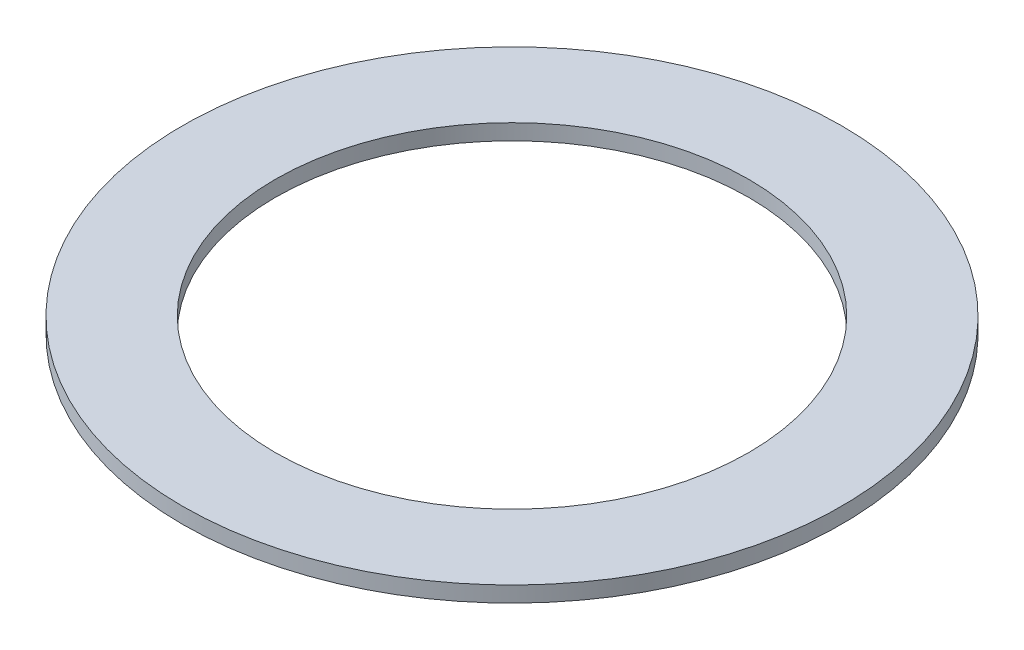
ISO-10303-21;
HEADER;
FILE_DESCRIPTION(('STEP AP214'),'2;1');
FILE_NAME('part.step','',(''),(''),'','','');
FILE_SCHEMA(('AUTOMOTIVE_DESIGN { 1 0 10303 214 1 1 1 1 }'));
ENDSEC;
DATA;
#1=APPLICATION_CONTEXT('core data for automotive mechanical design processes');
#2=APPLICATION_PROTOCOL_DEFINITION('international standard','automotive_design',2000,#1);
#3=PRODUCT_CONTEXT('',#1,'mechanical');
#4=PRODUCT('Part','Part','',(#3));
#5=PRODUCT_RELATED_PRODUCT_CATEGORY('part','',(#4));
#6=PRODUCT_DEFINITION_FORMATION('','',#4);
#7=PRODUCT_DEFINITION_CONTEXT('part definition',#1,'design');
#8=PRODUCT_DEFINITION('design','',#6,#7);
#9=PRODUCT_DEFINITION_SHAPE('','',#8);
#10=(LENGTH_UNIT() NAMED_UNIT(*) SI_UNIT(.MILLI.,.METRE.));
#11=(NAMED_UNIT(*) PLANE_ANGLE_UNIT() SI_UNIT($,.RADIAN.));
#12=(NAMED_UNIT(*) SI_UNIT($,.STERADIAN.) SOLID_ANGLE_UNIT());
#13=UNCERTAINTY_MEASURE_WITH_UNIT(LENGTH_MEASURE(1.E-05),#10,'distance_accuracy_value','');
#14=(GEOMETRIC_REPRESENTATION_CONTEXT(3) GLOBAL_UNCERTAINTY_ASSIGNED_CONTEXT((#13)) GLOBAL_UNIT_ASSIGNED_CONTEXT((#10,
#11,#12)) REPRESENTATION_CONTEXT('',''));
#15=CARTESIAN_POINT('',(0.,0.,0.));
#16=DIRECTION('',(0.,0.,1.));
#17=DIRECTION('',(1.,0.,0.));
#18=AXIS2_PLACEMENT_3D('',#15,#16,#17);
#19=CARTESIAN_POINT('',(0.,1.5,0.));
#20=DIRECTION('',(0.,-1.,0.));
#21=DIRECTION('',(0.,0.,-1.));
#22=AXIS2_PLACEMENT_3D('',#19,#20,#21);
#23=CYLINDRICAL_SURFACE('',#22,22.625);
#24=CARTESIAN_POINT('',(0.,1.5,0.));
#25=DIRECTION('',(0.,1.,0.));
#26=DIRECTION('',(0.,0.,1.));
#27=AXIS2_PLACEMENT_3D('',#24,#25,#26);
#28=CIRCLE('',#27,22.625);
#29=CARTESIAN_POINT('',(0.,1.5,22.625));
#30=VERTEX_POINT('',#29);
#31=EDGE_CURVE('E44',#30,#30,#28,.T.);
#32=ORIENTED_EDGE('',*,*,#31,.T.);
#33=EDGE_LOOP('',(#32));
#34=FACE_BOUND('',#33,.T.);
#35=CARTESIAN_POINT('',(0.,0.,0.));
#36=DIRECTION('',(0.,1.,0.));
#37=DIRECTION('',(0.,0.,1.));
#38=AXIS2_PLACEMENT_3D('',#35,#36,#37);
#39=CIRCLE('',#38,22.625);
#40=CARTESIAN_POINT('',(0.,0.,22.625));
#41=VERTEX_POINT('',#40);
#42=EDGE_CURVE('E50',#41,#41,#39,.T.);
#43=ORIENTED_EDGE('',*,*,#42,.F.);
#44=EDGE_LOOP('',(#43));
#45=FACE_BOUND('',#44,.T.);
#46=ADVANCED_FACE('F37',(#34,#45),#23,.F.);
#47=CARTESIAN_POINT('',(0.,1.5,0.));
#48=DIRECTION('',(0.,-1.,0.));
#49=DIRECTION('',(0.,0.,-1.));
#50=AXIS2_PLACEMENT_3D('',#47,#48,#49);
#51=CYLINDRICAL_SURFACE('',#50,31.5);
#52=CARTESIAN_POINT('',(0.,1.5,0.));
#53=DIRECTION('',(0.,1.,0.));
#54=DIRECTION('',(0.,0.,1.));
#55=AXIS2_PLACEMENT_3D('',#52,#53,#54);
#56=CIRCLE('',#55,31.5);
#57=CARTESIAN_POINT('',(0.,1.5,31.5));
#58=VERTEX_POINT('',#57);
#59=EDGE_CURVE('E10',#58,#58,#56,.T.);
#60=ORIENTED_EDGE('',*,*,#59,.F.);
#61=EDGE_LOOP('',(#60));
#62=FACE_BOUND('',#61,.T.);
#63=CARTESIAN_POINT('',(0.,0.,0.));
#64=DIRECTION('',(0.,1.,0.));
#65=DIRECTION('',(0.,0.,1.));
#66=AXIS2_PLACEMENT_3D('',#63,#64,#65);
#67=CIRCLE('',#66,31.5);
#68=CARTESIAN_POINT('',(0.,0.,31.5));
#69=VERTEX_POINT('',#68);
#70=EDGE_CURVE('E40',#69,#69,#67,.T.);
#71=ORIENTED_EDGE('',*,*,#70,.T.);
#72=EDGE_LOOP('',(#71));
#73=FACE_BOUND('',#72,.T.);
#74=ADVANCED_FACE('F57',(#62,#73),#51,.T.);
#75=CARTESIAN_POINT('',(0.,1.5,0.));
#76=DIRECTION('',(0.,1.,0.));
#77=DIRECTION('',(0.,0.,1.));
#78=AXIS2_PLACEMENT_3D('',#75,#76,#77);
#79=PLANE('',#78);
#80=ORIENTED_EDGE('',*,*,#31,.F.);
#81=EDGE_LOOP('',(#80));
#82=FACE_BOUND('',#81,.T.);
#83=ORIENTED_EDGE('',*,*,#59,.T.);
#84=EDGE_LOOP('',(#83));
#85=FACE_BOUND('',#84,.T.);
#86=ADVANCED_FACE('F61',(#82,#85),#79,.T.);
#87=CARTESIAN_POINT('',(0.,0.,0.));
#88=DIRECTION('',(0.,1.,0.));
#89=DIRECTION('',(0.,0.,1.));
#90=AXIS2_PLACEMENT_3D('',#87,#88,#89);
#91=PLANE('',#90);
#92=ORIENTED_EDGE('',*,*,#42,.T.);
#93=EDGE_LOOP('',(#92));
#94=FACE_BOUND('',#93,.T.);
#95=ORIENTED_EDGE('',*,*,#70,.F.);
#96=EDGE_LOOP('',(#95));
#97=FACE_BOUND('',#96,.T.);
#98=ADVANCED_FACE('F59',(#94,#97),#91,.F.);
#99=CLOSED_SHELL('',(#46,#74,#86,#98));
#100=MANIFOLD_SOLID_BREP('B2',#99);
#101=ADVANCED_BREP_SHAPE_REPRESENTATION('',(#18,#100),#14);
#102=SHAPE_DEFINITION_REPRESENTATION(#9,#101);
ENDSEC;
END-ISO-10303-21;
